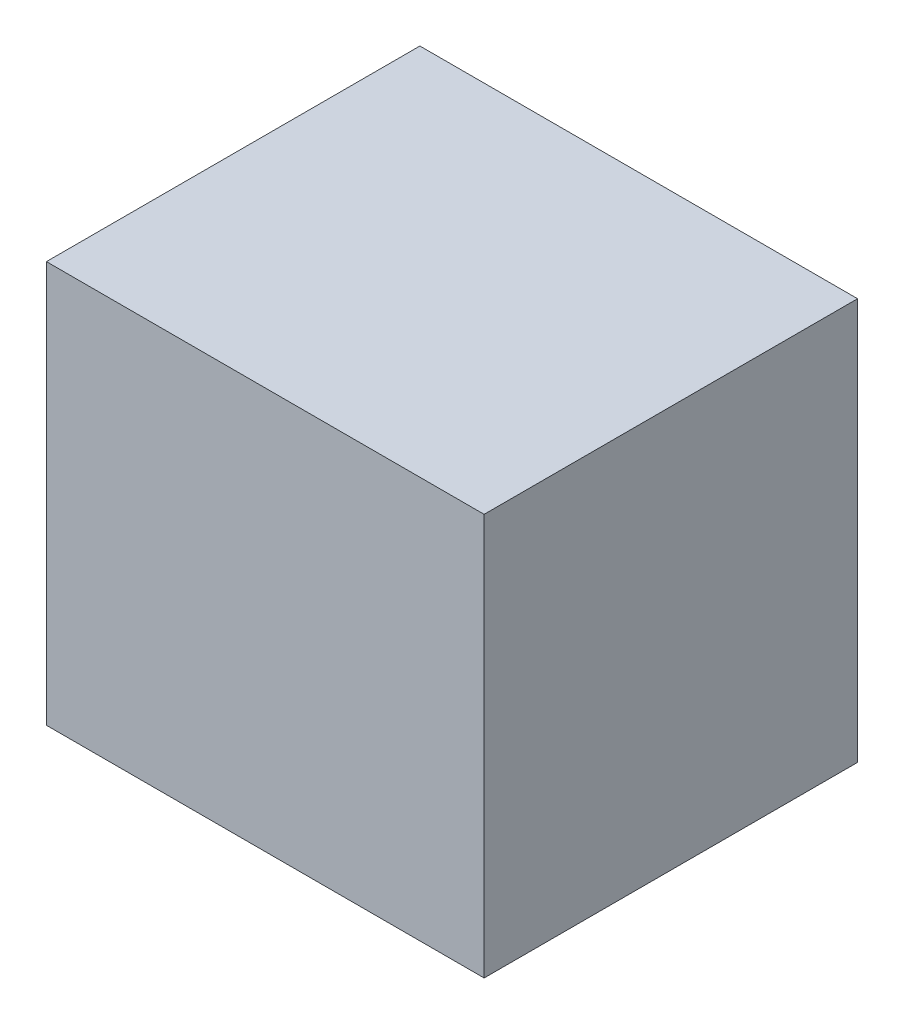
ISO-10303-21;
HEADER;
FILE_DESCRIPTION(('STEP AP214'),'2;1');
FILE_NAME('part.step','',(''),(''),'','','');
FILE_SCHEMA(('AUTOMOTIVE_DESIGN { 1 0 10303 214 1 1 1 1 }'));
ENDSEC;
DATA;
#1=APPLICATION_CONTEXT('core data for automotive mechanical design processes');
#2=APPLICATION_PROTOCOL_DEFINITION('international standard','automotive_design',2000,#1);
#3=PRODUCT_CONTEXT('',#1,'mechanical');
#4=PRODUCT('Part','Part','',(#3));
#5=PRODUCT_RELATED_PRODUCT_CATEGORY('part','',(#4));
#6=PRODUCT_DEFINITION_FORMATION('','',#4);
#7=PRODUCT_DEFINITION_CONTEXT('part definition',#1,'design');
#8=PRODUCT_DEFINITION('design','',#6,#7);
#9=PRODUCT_DEFINITION_SHAPE('','',#8);
#10=(LENGTH_UNIT() NAMED_UNIT(*) SI_UNIT(.MILLI.,.METRE.));
#11=(NAMED_UNIT(*) PLANE_ANGLE_UNIT() SI_UNIT($,.RADIAN.));
#12=(NAMED_UNIT(*) SI_UNIT($,.STERADIAN.) SOLID_ANGLE_UNIT());
#13=UNCERTAINTY_MEASURE_WITH_UNIT(LENGTH_MEASURE(1.E-05),#10,'distance_accuracy_value','');
#14=(GEOMETRIC_REPRESENTATION_CONTEXT(3) GLOBAL_UNCERTAINTY_ASSIGNED_CONTEXT((#13)) GLOBAL_UNIT_ASSIGNED_CONTEXT((#10,
#11,#12)) REPRESENTATION_CONTEXT('',''));
#15=CARTESIAN_POINT('',(0.,0.,0.));
#16=DIRECTION('',(0.,0.,1.));
#17=DIRECTION('',(1.,0.,0.));
#18=AXIS2_PLACEMENT_3D('',#15,#16,#17);
#19=CARTESIAN_POINT('',(5.4500018,5.00000016,9.3));
#20=DIRECTION('',(0.,0.,1.));
#21=DIRECTION('',(1.,0.,0.));
#22=AXIS2_PLACEMENT_3D('',#19,#20,#21);
#23=PLANE('',#22);
#24=DIRECTION('',(1.,0.,0.));
#25=VECTOR('',#24,1.);
#26=CARTESIAN_POINT('',(5.4500018,-5.00000016,9.3));
#27=LINE('',#26,#25);
#28=CARTESIAN_POINT('',(5.4500018,-5.00000016,9.3));
#29=VERTEX_POINT('',#28);
#30=CARTESIAN_POINT('',(-5.44999926,-5.00000016,9.3));
#31=VERTEX_POINT('',#30);
#32=EDGE_CURVE('E53',#29,#31,#27,.F.);
#33=ORIENTED_EDGE('',*,*,#32,.F.);
#34=DIRECTION('',(0.,1.,0.));
#35=VECTOR('',#34,1.);
#36=CARTESIAN_POINT('',(5.4500018,5.00000016,9.3));
#37=LINE('',#36,#35);
#38=CARTESIAN_POINT('',(5.4500018,5.00000016,9.3));
#39=VERTEX_POINT('',#38);
#40=EDGE_CURVE('E68',#39,#29,#37,.F.);
#41=ORIENTED_EDGE('',*,*,#40,.F.);
#42=DIRECTION('',(1.,0.,0.));
#43=VECTOR('',#42,1.);
#44=CARTESIAN_POINT('',(-5.44999926,5.00000016,9.3));
#45=LINE('',#44,#43);
#46=CARTESIAN_POINT('',(-5.44999926,5.00000016,9.3));
#47=VERTEX_POINT('',#46);
#48=EDGE_CURVE('E20',#47,#39,#45,.T.);
#49=ORIENTED_EDGE('',*,*,#48,.F.);
#50=DIRECTION('',(0.,1.,0.));
#51=VECTOR('',#50,1.);
#52=CARTESIAN_POINT('',(-5.44999926,-5.00000016,9.3));
#53=LINE('',#52,#51);
#54=EDGE_CURVE('E58',#31,#47,#53,.T.);
#55=ORIENTED_EDGE('',*,*,#54,.F.);
#56=EDGE_LOOP('',(#33,#41,#49,#55));
#57=FACE_BOUND('',#56,.T.);
#58=ADVANCED_FACE('F17',(#57),#23,.T.);
#59=CARTESIAN_POINT('',(-5.44999926,5.00000016,0.));
#60=DIRECTION('',(0.,1.,0.));
#61=DIRECTION('',(0.,0.,1.));
#62=AXIS2_PLACEMENT_3D('',#59,#60,#61);
#63=PLANE('',#62);
#64=DIRECTION('',(0.,0.,-1.));
#65=VECTOR('',#64,1.);
#66=CARTESIAN_POINT('',(5.4500018,5.00000016,0.));
#67=LINE('',#66,#65);
#68=CARTESIAN_POINT('',(5.4500018,5.00000016,0.));
#69=VERTEX_POINT('',#68);
#70=EDGE_CURVE('E79',#69,#39,#67,.F.);
#71=ORIENTED_EDGE('',*,*,#70,.F.);
#72=DIRECTION('',(1.,0.,0.));
#73=VECTOR('',#72,1.);
#74=CARTESIAN_POINT('',(5.4500018,5.00000016,0.));
#75=LINE('',#74,#73);
#76=CARTESIAN_POINT('',(-5.44999926,5.00000016,0.));
#77=VERTEX_POINT('',#76);
#78=EDGE_CURVE('E74',#69,#77,#75,.F.);
#79=ORIENTED_EDGE('',*,*,#78,.T.);
#80=DIRECTION('',(0.,0.,1.));
#81=VECTOR('',#80,1.);
#82=CARTESIAN_POINT('',(-5.44999926,5.00000016,0.));
#83=LINE('',#82,#81);
#84=EDGE_CURVE('E63',#47,#77,#83,.F.);
#85=ORIENTED_EDGE('',*,*,#84,.F.);
#86=ORIENTED_EDGE('',*,*,#48,.T.);
#87=EDGE_LOOP('',(#71,#79,#85,#86));
#88=FACE_BOUND('',#87,.T.);
#89=ADVANCED_FACE('F73',(#88),#63,.T.);
#90=CARTESIAN_POINT('',(-5.44999926,-5.00000016,0.));
#91=DIRECTION('',(-1.,0.,0.));
#92=DIRECTION('',(0.,0.,1.));
#93=AXIS2_PLACEMENT_3D('',#90,#91,#92);
#94=PLANE('',#93);
#95=ORIENTED_EDGE('',*,*,#84,.T.);
#96=DIRECTION('',(0.,1.,0.));
#97=VECTOR('',#96,1.);
#98=CARTESIAN_POINT('',(-5.44999926,5.00000016,0.));
#99=LINE('',#98,#97);
#100=CARTESIAN_POINT('',(-5.44999926,-5.00000016,0.));
#101=VERTEX_POINT('',#100);
#102=EDGE_CURVE('E84',#77,#101,#99,.F.);
#103=ORIENTED_EDGE('',*,*,#102,.T.);
#104=DIRECTION('',(0.,0.,-1.));
#105=VECTOR('',#104,1.);
#106=CARTESIAN_POINT('',(-5.44999926,-5.00000016,0.));
#107=LINE('',#106,#105);
#108=EDGE_CURVE('E65',#31,#101,#107,.T.);
#109=ORIENTED_EDGE('',*,*,#108,.F.);
#110=ORIENTED_EDGE('',*,*,#54,.T.);
#111=EDGE_LOOP('',(#95,#103,#109,#110));
#112=FACE_BOUND('',#111,.T.);
#113=ADVANCED_FACE('F60',(#112),#94,.T.);
#114=CARTESIAN_POINT('',(5.4500018,-5.00000016,0.));
#115=DIRECTION('',(0.,-1.,0.));
#116=DIRECTION('',(0.,0.,-1.));
#117=AXIS2_PLACEMENT_3D('',#114,#115,#116);
#118=PLANE('',#117);
#119=ORIENTED_EDGE('',*,*,#108,.T.);
#120=DIRECTION('',(1.,0.,0.));
#121=VECTOR('',#120,1.);
#122=CARTESIAN_POINT('',(5.4500018,-5.00000016,0.));
#123=LINE('',#122,#121);
#124=CARTESIAN_POINT('',(5.4500018,-5.00000016,0.));
#125=VERTEX_POINT('',#124);
#126=EDGE_CURVE('E26',#101,#125,#123,.T.);
#127=ORIENTED_EDGE('',*,*,#126,.T.);
#128=DIRECTION('',(0.,0.,-1.));
#129=VECTOR('',#128,1.);
#130=CARTESIAN_POINT('',(5.4500018,-5.00000016,0.));
#131=LINE('',#130,#129);
#132=EDGE_CURVE('E34',#29,#125,#131,.T.);
#133=ORIENTED_EDGE('',*,*,#132,.F.);
#134=ORIENTED_EDGE('',*,*,#32,.T.);
#135=EDGE_LOOP('',(#119,#127,#133,#134));
#136=FACE_BOUND('',#135,.T.);
#137=ADVANCED_FACE('F88',(#136),#118,.T.);
#138=CARTESIAN_POINT('',(5.4500018,5.00000016,0.));
#139=DIRECTION('',(1.,0.,0.));
#140=DIRECTION('',(0.,0.,-1.));
#141=AXIS2_PLACEMENT_3D('',#138,#139,#140);
#142=PLANE('',#141);
#143=ORIENTED_EDGE('',*,*,#132,.T.);
#144=DIRECTION('',(0.,1.,0.));
#145=VECTOR('',#144,1.);
#146=CARTESIAN_POINT('',(5.4500018,5.00000016,0.));
#147=LINE('',#146,#145);
#148=EDGE_CURVE('E11',#125,#69,#147,.T.);
#149=ORIENTED_EDGE('',*,*,#148,.T.);
#150=ORIENTED_EDGE('',*,*,#70,.T.);
#151=ORIENTED_EDGE('',*,*,#40,.T.);
#152=EDGE_LOOP('',(#143,#149,#150,#151));
#153=FACE_BOUND('',#152,.T.);
#154=ADVANCED_FACE('F91',(#153),#142,.T.);
#155=CARTESIAN_POINT('',(5.4500018,5.00000016,0.));
#156=DIRECTION('',(0.,0.,1.));
#157=DIRECTION('',(1.,0.,0.));
#158=AXIS2_PLACEMENT_3D('',#155,#156,#157);
#159=PLANE('',#158);
#160=ORIENTED_EDGE('',*,*,#126,.F.);
#161=ORIENTED_EDGE('',*,*,#102,.F.);
#162=ORIENTED_EDGE('',*,*,#78,.F.);
#163=ORIENTED_EDGE('',*,*,#148,.F.);
#164=EDGE_LOOP('',(#160,#161,#162,#163));
#165=FACE_BOUND('',#164,.T.);
#166=ADVANCED_FACE('F90',(#165),#159,.F.);
#167=CLOSED_SHELL('',(#58,#89,#113,#137,#154,#166));
#168=MANIFOLD_SOLID_BREP('B1',#167);
#169=ADVANCED_BREP_SHAPE_REPRESENTATION('',(#18,#168),#14);
#170=SHAPE_DEFINITION_REPRESENTATION(#9,#169);
ENDSEC;
END-ISO-10303-21;
